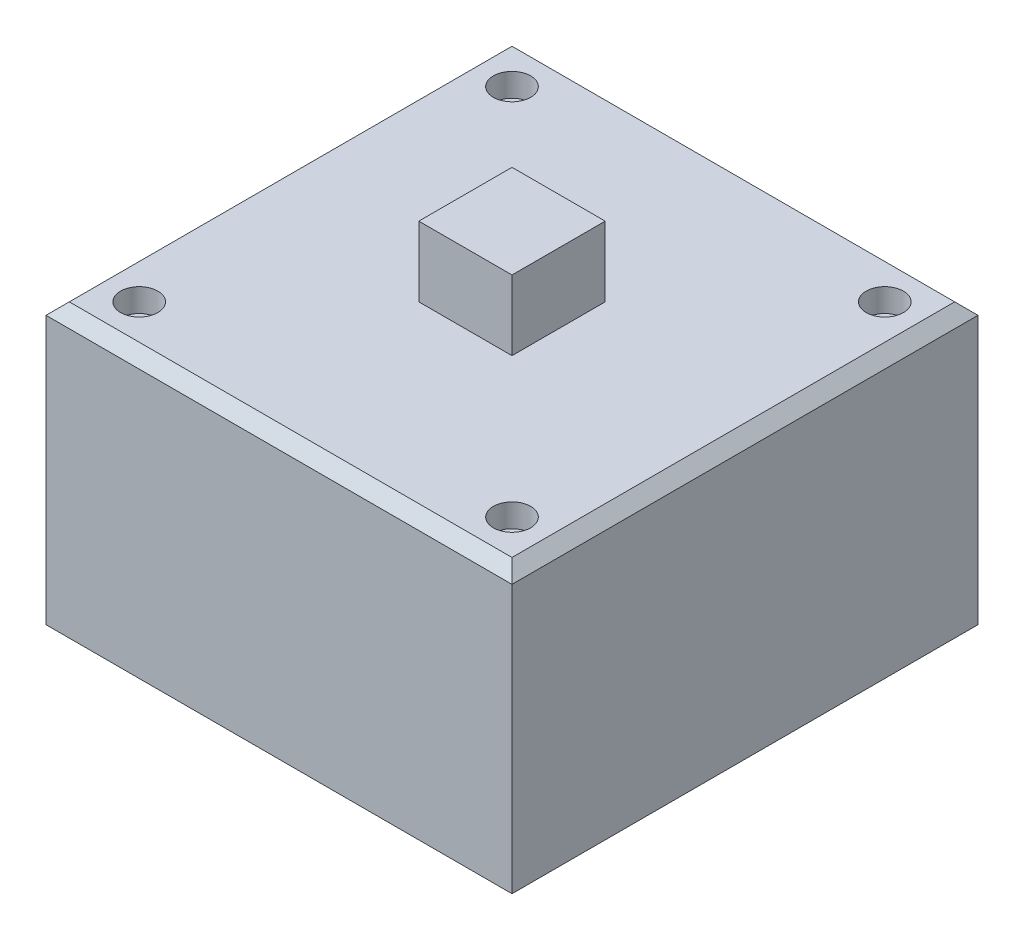
ISO-10303-21;
HEADER;
FILE_DESCRIPTION(('STEP AP214'),'2;1');
FILE_NAME('part.step','',(''),(''),'','','');
FILE_SCHEMA(('AUTOMOTIVE_DESIGN { 1 0 10303 214 1 1 1 1 }'));
ENDSEC;
DATA;
#1=APPLICATION_CONTEXT('core data for automotive mechanical design processes');
#2=APPLICATION_PROTOCOL_DEFINITION('international standard','automotive_design',2000,#1);
#3=PRODUCT_CONTEXT('',#1,'mechanical');
#4=PRODUCT('Part','Part','',(#3));
#5=PRODUCT_RELATED_PRODUCT_CATEGORY('part','',(#4));
#6=PRODUCT_DEFINITION_FORMATION('','',#4);
#7=PRODUCT_DEFINITION_CONTEXT('part definition',#1,'design');
#8=PRODUCT_DEFINITION('design','',#6,#7);
#9=PRODUCT_DEFINITION_SHAPE('','',#8);
#10=(LENGTH_UNIT() NAMED_UNIT(*) SI_UNIT(.MILLI.,.METRE.));
#11=(NAMED_UNIT(*) PLANE_ANGLE_UNIT() SI_UNIT($,.RADIAN.));
#12=(NAMED_UNIT(*) SI_UNIT($,.STERADIAN.) SOLID_ANGLE_UNIT());
#13=UNCERTAINTY_MEASURE_WITH_UNIT(LENGTH_MEASURE(1.E-05),#10,'distance_accuracy_value','');
#14=(GEOMETRIC_REPRESENTATION_CONTEXT(3) GLOBAL_UNCERTAINTY_ASSIGNED_CONTEXT((#13)) GLOBAL_UNIT_ASSIGNED_CONTEXT((#10,
#11,#12)) REPRESENTATION_CONTEXT('',''));
#15=CARTESIAN_POINT('',(0.,0.,0.));
#16=DIRECTION('',(0.,0.,1.));
#17=DIRECTION('',(1.,0.,0.));
#18=AXIS2_PLACEMENT_3D('',#15,#16,#17);
#19=CARTESIAN_POINT('',(-25.4,38.1,25.4));
#20=DIRECTION('',(1.,0.,0.));
#21=DIRECTION('',(0.,0.,-1.));
#22=AXIS2_PLACEMENT_3D('',#19,#20,#21);
#23=PLANE('',#22);
#24=DIRECTION('',(0.,-1.,0.));
#25=VECTOR('',#24,1.);
#26=CARTESIAN_POINT('',(-25.4,38.1,25.4));
#27=LINE('',#26,#25);
#28=CARTESIAN_POINT('',(-25.4,29.21,25.4));
#29=VERTEX_POINT('',#28);
#30=CARTESIAN_POINT('',(-25.4,0.,25.4));
#31=VERTEX_POINT('',#30);
#32=EDGE_CURVE('E233',#29,#31,#27,.T.);
#33=ORIENTED_EDGE('',*,*,#32,.F.);
#34=DIRECTION('',(0.,0.,-1.));
#35=VECTOR('',#34,1.);
#36=CARTESIAN_POINT('',(-25.4,29.21,-25.4));
#37=LINE('',#36,#35);
#38=CARTESIAN_POINT('',(-25.4,29.21,-25.4));
#39=VERTEX_POINT('',#38);
#40=EDGE_CURVE('E253',#29,#39,#37,.T.);
#41=ORIENTED_EDGE('',*,*,#40,.T.);
#42=DIRECTION('',(0.,-1.,0.));
#43=VECTOR('',#42,1.);
#44=CARTESIAN_POINT('',(-25.4,38.1,-25.4));
#45=LINE('',#44,#43);
#46=CARTESIAN_POINT('',(-25.4,0.,-25.4));
#47=VERTEX_POINT('',#46);
#48=EDGE_CURVE('E224',#39,#47,#45,.T.);
#49=ORIENTED_EDGE('',*,*,#48,.T.);
#50=DIRECTION('',(0.,0.,1.));
#51=VECTOR('',#50,1.);
#52=CARTESIAN_POINT('',(-25.4,0.,25.4));
#53=LINE('',#52,#51);
#54=EDGE_CURVE('E203',#47,#31,#53,.T.);
#55=ORIENTED_EDGE('',*,*,#54,.T.);
#56=EDGE_LOOP('',(#33,#41,#49,#55));
#57=FACE_BOUND('',#56,.T.);
#58=ADVANCED_FACE('F71',(#57),#23,.F.);
#59=CARTESIAN_POINT('',(25.4,38.1,25.4));
#60=DIRECTION('',(0.,0.,-1.));
#61=DIRECTION('',(-1.,0.,0.));
#62=AXIS2_PLACEMENT_3D('',#59,#60,#61);
#63=PLANE('',#62);
#64=DIRECTION('',(0.,-1.,0.));
#65=VECTOR('',#64,1.);
#66=CARTESIAN_POINT('',(25.4,38.1,25.4));
#67=LINE('',#66,#65);
#68=CARTESIAN_POINT('',(25.4,29.21,25.4));
#69=VERTEX_POINT('',#68);
#70=CARTESIAN_POINT('',(25.4,0.,25.4));
#71=VERTEX_POINT('',#70);
#72=EDGE_CURVE('E230',#69,#71,#67,.T.);
#73=ORIENTED_EDGE('',*,*,#72,.F.);
#74=DIRECTION('',(-1.,0.,0.));
#75=VECTOR('',#74,1.);
#76=CARTESIAN_POINT('',(-25.4,29.21,25.4));
#77=LINE('',#76,#75);
#78=EDGE_CURVE('E82',#69,#29,#77,.T.);
#79=ORIENTED_EDGE('',*,*,#78,.T.);
#80=ORIENTED_EDGE('',*,*,#32,.T.);
#81=DIRECTION('',(1.,0.,0.));
#82=VECTOR('',#81,1.);
#83=CARTESIAN_POINT('',(25.4,0.,25.4));
#84=LINE('',#83,#82);
#85=EDGE_CURVE('E212',#31,#71,#84,.T.);
#86=ORIENTED_EDGE('',*,*,#85,.T.);
#87=EDGE_LOOP('',(#73,#79,#80,#86));
#88=FACE_BOUND('',#87,.T.);
#89=ADVANCED_FACE('F359',(#88),#63,.F.);
#90=CARTESIAN_POINT('',(25.4,38.1,25.4));
#91=DIRECTION('',(-1.,0.,0.));
#92=DIRECTION('',(0.,0.,1.));
#93=AXIS2_PLACEMENT_3D('',#90,#91,#92);
#94=PLANE('',#93);
#95=DIRECTION('',(0.,-1.,0.));
#96=VECTOR('',#95,1.);
#97=CARTESIAN_POINT('',(25.4,38.1,-25.4));
#98=LINE('',#97,#96);
#99=CARTESIAN_POINT('',(25.4,29.21,-25.4));
#100=VERTEX_POINT('',#99);
#101=CARTESIAN_POINT('',(25.4,0.,-25.4));
#102=VERTEX_POINT('',#101);
#103=EDGE_CURVE('E227',#100,#102,#98,.T.);
#104=ORIENTED_EDGE('',*,*,#103,.F.);
#105=DIRECTION('',(0.,0.,1.));
#106=VECTOR('',#105,1.);
#107=CARTESIAN_POINT('',(25.4,29.21,25.4));
#108=LINE('',#107,#106);
#109=EDGE_CURVE('E12',#100,#69,#108,.T.);
#110=ORIENTED_EDGE('',*,*,#109,.T.);
#111=ORIENTED_EDGE('',*,*,#72,.T.);
#112=DIRECTION('',(0.,0.,-1.));
#113=VECTOR('',#112,1.);
#114=CARTESIAN_POINT('',(25.4,0.,25.4));
#115=LINE('',#114,#113);
#116=EDGE_CURVE('E216',#71,#102,#115,.T.);
#117=ORIENTED_EDGE('',*,*,#116,.T.);
#118=EDGE_LOOP('',(#104,#110,#111,#117));
#119=FACE_BOUND('',#118,.T.);
#120=ADVANCED_FACE('F366',(#119),#94,.F.);
#121=CARTESIAN_POINT('',(25.4,38.1,-25.4));
#122=DIRECTION('',(0.,0.,1.));
#123=DIRECTION('',(1.,0.,0.));
#124=AXIS2_PLACEMENT_3D('',#121,#122,#123);
#125=PLANE('',#124);
#126=ORIENTED_EDGE('',*,*,#48,.F.);
#127=DIRECTION('',(1.,0.,0.));
#128=VECTOR('',#127,1.);
#129=CARTESIAN_POINT('',(25.4,29.21,-25.4));
#130=LINE('',#129,#128);
#131=EDGE_CURVE('E249',#39,#100,#130,.T.);
#132=ORIENTED_EDGE('',*,*,#131,.T.);
#133=ORIENTED_EDGE('',*,*,#103,.T.);
#134=DIRECTION('',(-1.,0.,0.));
#135=VECTOR('',#134,1.);
#136=CARTESIAN_POINT('',(25.4,0.,-25.4));
#137=LINE('',#136,#135);
#138=EDGE_CURVE('E220',#102,#47,#137,.T.);
#139=ORIENTED_EDGE('',*,*,#138,.T.);
#140=EDGE_LOOP('',(#126,#132,#133,#139));
#141=FACE_BOUND('',#140,.T.);
#142=ADVANCED_FACE('F353',(#141),#125,.F.);
#143=CARTESIAN_POINT('',(0.,0.,0.));
#144=DIRECTION('',(0.,1.,0.));
#145=DIRECTION('',(0.,0.,1.));
#146=AXIS2_PLACEMENT_3D('',#143,#144,#145);
#147=PLANE('',#146);
#148=ORIENTED_EDGE('',*,*,#54,.F.);
#149=ORIENTED_EDGE('',*,*,#138,.F.);
#150=ORIENTED_EDGE('',*,*,#116,.F.);
#151=ORIENTED_EDGE('',*,*,#85,.F.);
#152=EDGE_LOOP('',(#148,#149,#150,#151));
#153=FACE_BOUND('',#152,.T.);
#154=ADVANCED_FACE('F342',(#153),#147,.F.);
#155=CARTESIAN_POINT('',(0.,30.48,0.));
#156=DIRECTION('',(0.,1.,0.));
#157=DIRECTION('',(0.,0.,1.));
#158=AXIS2_PLACEMENT_3D('',#155,#156,#157);
#159=PLANE('',#158);
#160=DIRECTION('',(0.,0.,-1.));
#161=VECTOR('',#160,1.);
#162=CARTESIAN_POINT('',(24.13,30.48,-25.4));
#163=LINE('',#162,#161);
#164=CARTESIAN_POINT('',(24.13,30.48,24.13));
#165=VERTEX_POINT('',#164);
#166=CARTESIAN_POINT('',(24.13,30.48,-24.13));
#167=VERTEX_POINT('',#166);
#168=EDGE_CURVE('E236',#165,#167,#163,.T.);
#169=ORIENTED_EDGE('',*,*,#168,.T.);
#170=DIRECTION('',(-1.,0.,0.));
#171=VECTOR('',#170,1.);
#172=CARTESIAN_POINT('',(-25.4,30.48,-24.13));
#173=LINE('',#172,#171);
#174=CARTESIAN_POINT('',(-24.13,30.48,-24.13));
#175=VERTEX_POINT('',#174);
#176=EDGE_CURVE('E245',#167,#175,#173,.T.);
#177=ORIENTED_EDGE('',*,*,#176,.T.);
#178=DIRECTION('',(0.,0.,1.));
#179=VECTOR('',#178,1.);
#180=CARTESIAN_POINT('',(-24.13,30.48,25.4));
#181=LINE('',#180,#179);
#182=CARTESIAN_POINT('',(-24.13,30.48,24.13));
#183=VERTEX_POINT('',#182);
#184=EDGE_CURVE('E242',#175,#183,#181,.T.);
#185=ORIENTED_EDGE('',*,*,#184,.T.);
#186=DIRECTION('',(1.,0.,0.));
#187=VECTOR('',#186,1.);
#188=CARTESIAN_POINT('',(25.4,30.48,24.13));
#189=LINE('',#188,#187);
#190=EDGE_CURVE('E239',#183,#165,#189,.T.);
#191=ORIENTED_EDGE('',*,*,#190,.T.);
#192=EDGE_LOOP('',(#169,#177,#185,#191));
#193=FACE_BOUND('',#192,.T.);
#194=CARTESIAN_POINT('',(20.3199999999998,30.48,20.3200000000002));
#195=DIRECTION('',(0.,1.,0.));
#196=DIRECTION('',(0.,0.,1.));
#197=AXIS2_PLACEMENT_3D('',#194,#195,#196);
#198=CIRCLE('',#197,2.032);
#199=CARTESIAN_POINT('',(20.3199999999998,30.48,22.3520000000002));
#200=VERTEX_POINT('',#199);
#201=EDGE_CURVE('E325',#200,#200,#198,.T.);
#202=ORIENTED_EDGE('',*,*,#201,.F.);
#203=EDGE_LOOP('',(#202));
#204=FACE_BOUND('',#203,.T.);
#205=CARTESIAN_POINT('',(20.3200000000001,30.48,-20.3199999999999));
#206=DIRECTION('',(0.,1.,0.));
#207=DIRECTION('',(0.,0.,1.));
#208=AXIS2_PLACEMENT_3D('',#205,#206,#207);
#209=CIRCLE('',#208,2.032);
#210=CARTESIAN_POINT('',(20.3200000000001,30.48,-18.2879999999999));
#211=VERTEX_POINT('',#210);
#212=EDGE_CURVE('E317',#211,#211,#209,.T.);
#213=ORIENTED_EDGE('',*,*,#212,.F.);
#214=EDGE_LOOP('',(#213));
#215=FACE_BOUND('',#214,.T.);
#216=CARTESIAN_POINT('',(-20.3199999999999,30.48,-20.3200000000001));
#217=DIRECTION('',(0.,1.,0.));
#218=DIRECTION('',(0.,0.,1.));
#219=AXIS2_PLACEMENT_3D('',#216,#217,#218);
#220=CIRCLE('',#219,2.032);
#221=CARTESIAN_POINT('',(-20.3199999999999,30.48,-18.2880000000001));
#222=VERTEX_POINT('',#221);
#223=EDGE_CURVE('E309',#222,#222,#220,.T.);
#224=ORIENTED_EDGE('',*,*,#223,.F.);
#225=EDGE_LOOP('',(#224));
#226=FACE_BOUND('',#225,.T.);
#227=CARTESIAN_POINT('',(-20.32,30.48,20.32));
#228=DIRECTION('',(0.,1.,0.));
#229=DIRECTION('',(0.,0.,1.));
#230=AXIS2_PLACEMENT_3D('',#227,#228,#229);
#231=CIRCLE('',#230,2.032);
#232=CARTESIAN_POINT('',(-20.32,30.48,22.352));
#233=VERTEX_POINT('',#232);
#234=EDGE_CURVE('E186',#233,#233,#231,.T.);
#235=ORIENTED_EDGE('',*,*,#234,.F.);
#236=EDGE_LOOP('',(#235));
#237=FACE_BOUND('',#236,.T.);
#238=DIRECTION('',(0.,0.,-1.));
#239=VECTOR('',#238,1.);
#240=CARTESIAN_POINT('',(5.08,30.48,5.08));
#241=LINE('',#240,#239);
#242=CARTESIAN_POINT('',(5.08,30.48,5.08));
#243=VERTEX_POINT('',#242);
#244=CARTESIAN_POINT('',(5.08,30.48,-5.08));
#245=VERTEX_POINT('',#244);
#246=EDGE_CURVE('E174',#243,#245,#241,.T.);
#247=ORIENTED_EDGE('',*,*,#246,.F.);
#248=DIRECTION('',(-1.,0.,0.));
#249=VECTOR('',#248,1.);
#250=CARTESIAN_POINT('',(5.08,30.48,5.08));
#251=LINE('',#250,#249);
#252=CARTESIAN_POINT('',(-5.08,30.48,5.08));
#253=VERTEX_POINT('',#252);
#254=EDGE_CURVE('E159',#243,#253,#251,.T.);
#255=ORIENTED_EDGE('',*,*,#254,.T.);
#256=DIRECTION('',(0.,0.,-1.));
#257=VECTOR('',#256,1.);
#258=CARTESIAN_POINT('',(-5.08,30.48,5.08));
#259=LINE('',#258,#257);
#260=CARTESIAN_POINT('',(-5.08,30.48,-5.08));
#261=VERTEX_POINT('',#260);
#262=EDGE_CURVE('E151',#253,#261,#259,.T.);
#263=ORIENTED_EDGE('',*,*,#262,.T.);
#264=DIRECTION('',(-1.,0.,0.));
#265=VECTOR('',#264,1.);
#266=CARTESIAN_POINT('',(5.08,30.48,-5.08));
#267=LINE('',#266,#265);
#268=EDGE_CURVE('E156',#245,#261,#267,.T.);
#269=ORIENTED_EDGE('',*,*,#268,.F.);
#270=EDGE_LOOP('',(#247,#255,#263,#269));
#271=FACE_BOUND('',#270,.T.);
#272=ADVANCED_FACE('F154',(#193,#204,#215,#226,#237,#271),#159,.T.);
#273=CARTESIAN_POINT('',(5.08,30.48,-5.08));
#274=DIRECTION('',(0.,0.,-1.));
#275=DIRECTION('',(-1.,0.,0.));
#276=AXIS2_PLACEMENT_3D('',#273,#274,#275);
#277=PLANE('',#276);
#278=DIRECTION('',(-1.,0.,0.));
#279=VECTOR('',#278,1.);
#280=CARTESIAN_POINT('',(5.08,38.1,-5.08));
#281=LINE('',#280,#279);
#282=CARTESIAN_POINT('',(5.08,38.1,-5.08));
#283=VERTEX_POINT('',#282);
#284=CARTESIAN_POINT('',(-5.08,38.1,-5.08));
#285=VERTEX_POINT('',#284);
#286=EDGE_CURVE('E193',#283,#285,#281,.T.);
#287=ORIENTED_EDGE('',*,*,#286,.F.);
#288=DIRECTION('',(0.,1.,0.));
#289=VECTOR('',#288,1.);
#290=CARTESIAN_POINT('',(5.08,30.48,-5.08));
#291=LINE('',#290,#289);
#292=EDGE_CURVE('E177',#245,#283,#291,.T.);
#293=ORIENTED_EDGE('',*,*,#292,.F.);
#294=ORIENTED_EDGE('',*,*,#268,.T.);
#295=DIRECTION('',(0.,1.,0.));
#296=VECTOR('',#295,1.);
#297=CARTESIAN_POINT('',(-5.08,30.48,-5.08));
#298=LINE('',#297,#296);
#299=EDGE_CURVE('E165',#261,#285,#298,.T.);
#300=ORIENTED_EDGE('',*,*,#299,.T.);
#301=EDGE_LOOP('',(#287,#293,#294,#300));
#302=FACE_BOUND('',#301,.T.);
#303=ADVANCED_FACE('F176',(#302),#277,.T.);
#304=CARTESIAN_POINT('',(5.08,30.48,5.08));
#305=DIRECTION('',(1.,0.,0.));
#306=DIRECTION('',(0.,0.,-1.));
#307=AXIS2_PLACEMENT_3D('',#304,#305,#306);
#308=PLANE('',#307);
#309=DIRECTION('',(0.,0.,-1.));
#310=VECTOR('',#309,1.);
#311=CARTESIAN_POINT('',(5.08,38.1,5.08));
#312=LINE('',#311,#310);
#313=CARTESIAN_POINT('',(5.08,38.1,5.08));
#314=VERTEX_POINT('',#313);
#315=EDGE_CURVE('E179',#314,#283,#312,.T.);
#316=ORIENTED_EDGE('',*,*,#315,.F.);
#317=DIRECTION('',(0.,1.,0.));
#318=VECTOR('',#317,1.);
#319=CARTESIAN_POINT('',(5.08,30.48,5.08));
#320=LINE('',#319,#318);
#321=EDGE_CURVE('E204',#243,#314,#320,.T.);
#322=ORIENTED_EDGE('',*,*,#321,.F.);
#323=ORIENTED_EDGE('',*,*,#246,.T.);
#324=ORIENTED_EDGE('',*,*,#292,.T.);
#325=EDGE_LOOP('',(#316,#322,#323,#324));
#326=FACE_BOUND('',#325,.T.);
#327=ADVANCED_FACE('F350',(#326),#308,.T.);
#328=CARTESIAN_POINT('',(5.08,30.48,5.08));
#329=DIRECTION('',(0.,0.,-1.));
#330=DIRECTION('',(-1.,0.,0.));
#331=AXIS2_PLACEMENT_3D('',#328,#329,#330);
#332=PLANE('',#331);
#333=DIRECTION('',(-1.,0.,0.));
#334=VECTOR('',#333,1.);
#335=CARTESIAN_POINT('',(5.08,38.1,5.08));
#336=LINE('',#335,#334);
#337=CARTESIAN_POINT('',(-5.08,38.1,5.08));
#338=VERTEX_POINT('',#337);
#339=EDGE_CURVE('E183',#314,#338,#336,.T.);
#340=ORIENTED_EDGE('',*,*,#339,.T.);
#341=DIRECTION('',(0.,1.,0.));
#342=VECTOR('',#341,1.);
#343=CARTESIAN_POINT('',(-5.08,30.48,5.08));
#344=LINE('',#343,#342);
#345=EDGE_CURVE('E173',#253,#338,#344,.T.);
#346=ORIENTED_EDGE('',*,*,#345,.F.);
#347=ORIENTED_EDGE('',*,*,#254,.F.);
#348=ORIENTED_EDGE('',*,*,#321,.T.);
#349=EDGE_LOOP('',(#340,#346,#347,#348));
#350=FACE_BOUND('',#349,.T.);
#351=ADVANCED_FACE('F421',(#350),#332,.F.);
#352=CARTESIAN_POINT('',(-5.08,30.48,5.08));
#353=DIRECTION('',(1.,0.,0.));
#354=DIRECTION('',(0.,0.,-1.));
#355=AXIS2_PLACEMENT_3D('',#352,#353,#354);
#356=PLANE('',#355);
#357=DIRECTION('',(0.,0.,-1.));
#358=VECTOR('',#357,1.);
#359=CARTESIAN_POINT('',(-5.08,38.1,5.08));
#360=LINE('',#359,#358);
#361=EDGE_CURVE('E168',#338,#285,#360,.T.);
#362=ORIENTED_EDGE('',*,*,#361,.T.);
#363=ORIENTED_EDGE('',*,*,#299,.F.);
#364=ORIENTED_EDGE('',*,*,#262,.F.);
#365=ORIENTED_EDGE('',*,*,#345,.T.);
#366=EDGE_LOOP('',(#362,#363,#364,#365));
#367=FACE_BOUND('',#366,.T.);
#368=ADVANCED_FACE('F166',(#367),#356,.F.);
#369=CARTESIAN_POINT('',(0.,38.1,0.));
#370=DIRECTION('',(0.,1.,0.));
#371=DIRECTION('',(0.,0.,1.));
#372=AXIS2_PLACEMENT_3D('',#369,#370,#371);
#373=PLANE('',#372);
#374=ORIENTED_EDGE('',*,*,#315,.T.);
#375=ORIENTED_EDGE('',*,*,#286,.T.);
#376=ORIENTED_EDGE('',*,*,#361,.F.);
#377=ORIENTED_EDGE('',*,*,#339,.F.);
#378=EDGE_LOOP('',(#374,#375,#376,#377));
#379=FACE_BOUND('',#378,.T.);
#380=ADVANCED_FACE('F411',(#379),#373,.T.);
#381=CARTESIAN_POINT('',(-20.32,27.94,20.32));
#382=DIRECTION('',(0.,1.,0.));
#383=DIRECTION('',(0.,0.,1.));
#384=AXIS2_PLACEMENT_3D('',#381,#382,#383);
#385=CYLINDRICAL_SURFACE('',#384,2.032);
#386=CARTESIAN_POINT('',(-20.32,27.94,20.32));
#387=DIRECTION('',(0.,1.,0.));
#388=DIRECTION('',(0.,0.,1.));
#389=AXIS2_PLACEMENT_3D('',#386,#387,#388);
#390=CIRCLE('',#389,2.032);
#391=CARTESIAN_POINT('',(-20.32,27.94,22.352));
#392=VERTEX_POINT('',#391);
#393=EDGE_CURVE('E196',#392,#392,#390,.T.);
#394=ORIENTED_EDGE('',*,*,#393,.F.);
#395=EDGE_LOOP('',(#394));
#396=FACE_BOUND('',#395,.T.);
#397=ORIENTED_EDGE('',*,*,#234,.T.);
#398=EDGE_LOOP('',(#397));
#399=FACE_BOUND('',#398,.T.);
#400=ADVANCED_FACE('F339',(#396,#399),#385,.F.);
#401=CARTESIAN_POINT('',(-20.32,27.94,20.32));
#402=DIRECTION('',(0.,1.,0.));
#403=DIRECTION('',(0.,0.,1.));
#404=AXIS2_PLACEMENT_3D('',#401,#402,#403);
#405=PLANE('',#404);
#406=CARTESIAN_POINT('',(-20.32,27.94,20.32));
#407=DIRECTION('',(0.,1.,0.));
#408=DIRECTION('',(0.,0.,1.));
#409=AXIS2_PLACEMENT_3D('',#406,#407,#408);
#410=CIRCLE('',#409,1.524);
#411=CARTESIAN_POINT('',(-20.32,27.94,21.844));
#412=VERTEX_POINT('',#411);
#413=EDGE_CURVE('E304',#412,#412,#410,.T.);
#414=ORIENTED_EDGE('',*,*,#413,.F.);
#415=EDGE_LOOP('',(#414));
#416=FACE_BOUND('',#415,.T.);
#417=ORIENTED_EDGE('',*,*,#393,.T.);
#418=EDGE_LOOP('',(#417));
#419=FACE_BOUND('',#418,.T.);
#420=ADVANCED_FACE('F418',(#416,#419),#405,.T.);
#421=CARTESIAN_POINT('',(-20.3199999999999,27.94,-20.3200000000001));
#422=DIRECTION('',(0.,1.,0.));
#423=DIRECTION('',(0.,0.,1.));
#424=AXIS2_PLACEMENT_3D('',#421,#422,#423);
#425=CYLINDRICAL_SURFACE('',#424,2.032);
#426=CARTESIAN_POINT('',(-20.3199999999999,27.94,-20.3200000000001));
#427=DIRECTION('',(0.,1.,0.));
#428=DIRECTION('',(0.,0.,1.));
#429=AXIS2_PLACEMENT_3D('',#426,#427,#428);
#430=CIRCLE('',#429,2.032);
#431=CARTESIAN_POINT('',(-20.3199999999999,27.94,-18.2880000000001));
#432=VERTEX_POINT('',#431);
#433=EDGE_CURVE('E313',#432,#432,#430,.T.);
#434=ORIENTED_EDGE('',*,*,#433,.F.);
#435=EDGE_LOOP('',(#434));
#436=FACE_BOUND('',#435,.T.);
#437=ORIENTED_EDGE('',*,*,#223,.T.);
#438=EDGE_LOOP('',(#437));
#439=FACE_BOUND('',#438,.T.);
#440=ADVANCED_FACE('F436',(#436,#439),#425,.F.);
#441=CARTESIAN_POINT('',(-20.3199999999999,27.94,-20.3200000000001));
#442=DIRECTION('',(0.,1.,0.));
#443=DIRECTION('',(0.,0.,1.));
#444=AXIS2_PLACEMENT_3D('',#441,#442,#443);
#445=PLANE('',#444);
#446=CARTESIAN_POINT('',(-20.3199999999999,27.94,-20.3200000000001));
#447=DIRECTION('',(0.,1.,0.));
#448=DIRECTION('',(0.,0.,1.));
#449=AXIS2_PLACEMENT_3D('',#446,#447,#448);
#450=CIRCLE('',#449,1.524);
#451=CARTESIAN_POINT('',(-20.3199999999999,27.94,-18.7960000000001));
#452=VERTEX_POINT('',#451);
#453=EDGE_CURVE('E300',#452,#452,#450,.T.);
#454=ORIENTED_EDGE('',*,*,#453,.F.);
#455=EDGE_LOOP('',(#454));
#456=FACE_BOUND('',#455,.T.);
#457=ORIENTED_EDGE('',*,*,#433,.T.);
#458=EDGE_LOOP('',(#457));
#459=FACE_BOUND('',#458,.T.);
#460=ADVANCED_FACE('F454',(#456,#459),#445,.T.);
#461=CARTESIAN_POINT('',(20.3200000000001,27.94,-20.3199999999999));
#462=DIRECTION('',(0.,1.,0.));
#463=DIRECTION('',(0.,0.,1.));
#464=AXIS2_PLACEMENT_3D('',#461,#462,#463);
#465=CYLINDRICAL_SURFACE('',#464,2.032);
#466=CARTESIAN_POINT('',(20.3200000000001,27.94,-20.3199999999999));
#467=DIRECTION('',(0.,1.,0.));
#468=DIRECTION('',(0.,0.,1.));
#469=AXIS2_PLACEMENT_3D('',#466,#467,#468);
#470=CIRCLE('',#469,2.032);
#471=CARTESIAN_POINT('',(20.3200000000001,27.94,-18.2879999999999));
#472=VERTEX_POINT('',#471);
#473=EDGE_CURVE('E321',#472,#472,#470,.T.);
#474=ORIENTED_EDGE('',*,*,#473,.F.);
#475=EDGE_LOOP('',(#474));
#476=FACE_BOUND('',#475,.T.);
#477=ORIENTED_EDGE('',*,*,#212,.T.);
#478=EDGE_LOOP('',(#477));
#479=FACE_BOUND('',#478,.T.);
#480=ADVANCED_FACE('F450',(#476,#479),#465,.F.);
#481=CARTESIAN_POINT('',(20.3200000000001,27.94,-20.3199999999999));
#482=DIRECTION('',(0.,1.,0.));
#483=DIRECTION('',(0.,0.,1.));
#484=AXIS2_PLACEMENT_3D('',#481,#482,#483);
#485=PLANE('',#484);
#486=CARTESIAN_POINT('',(20.3200000000001,27.94,-20.3199999999999));
#487=DIRECTION('',(0.,1.,0.));
#488=DIRECTION('',(0.,0.,1.));
#489=AXIS2_PLACEMENT_3D('',#486,#487,#488);
#490=CIRCLE('',#489,1.524);
#491=CARTESIAN_POINT('',(20.3200000000001,27.94,-18.7959999999999));
#492=VERTEX_POINT('',#491);
#493=EDGE_CURVE('E296',#492,#492,#490,.T.);
#494=ORIENTED_EDGE('',*,*,#493,.F.);
#495=EDGE_LOOP('',(#494));
#496=FACE_BOUND('',#495,.T.);
#497=ORIENTED_EDGE('',*,*,#473,.T.);
#498=EDGE_LOOP('',(#497));
#499=FACE_BOUND('',#498,.T.);
#500=ADVANCED_FACE('F446',(#496,#499),#485,.T.);
#501=CARTESIAN_POINT('',(20.3199999999998,27.94,20.3200000000002));
#502=DIRECTION('',(0.,1.,0.));
#503=DIRECTION('',(0.,0.,1.));
#504=AXIS2_PLACEMENT_3D('',#501,#502,#503);
#505=CYLINDRICAL_SURFACE('',#504,2.032);
#506=CARTESIAN_POINT('',(20.3199999999998,27.94,20.3200000000002));
#507=DIRECTION('',(0.,1.,0.));
#508=DIRECTION('',(0.,0.,1.));
#509=AXIS2_PLACEMENT_3D('',#506,#507,#508);
#510=CIRCLE('',#509,2.032);
#511=CARTESIAN_POINT('',(20.3199999999998,27.94,22.3520000000002));
#512=VERTEX_POINT('',#511);
#513=EDGE_CURVE('E308',#512,#512,#510,.T.);
#514=ORIENTED_EDGE('',*,*,#513,.F.);
#515=EDGE_LOOP('',(#514));
#516=FACE_BOUND('',#515,.T.);
#517=ORIENTED_EDGE('',*,*,#201,.T.);
#518=EDGE_LOOP('',(#517));
#519=FACE_BOUND('',#518,.T.);
#520=ADVANCED_FACE('F442',(#516,#519),#505,.F.);
#521=CARTESIAN_POINT('',(20.3199999999998,27.94,20.3200000000002));
#522=DIRECTION('',(0.,1.,0.));
#523=DIRECTION('',(0.,0.,1.));
#524=AXIS2_PLACEMENT_3D('',#521,#522,#523);
#525=PLANE('',#524);
#526=CARTESIAN_POINT('',(20.3199999999998,27.94,20.3200000000002));
#527=DIRECTION('',(0.,1.,0.));
#528=DIRECTION('',(0.,0.,1.));
#529=AXIS2_PLACEMENT_3D('',#526,#527,#528);
#530=CIRCLE('',#529,1.524);
#531=CARTESIAN_POINT('',(20.3199999999998,27.94,21.8440000000002));
#532=VERTEX_POINT('',#531);
#533=EDGE_CURVE('E292',#532,#532,#530,.T.);
#534=ORIENTED_EDGE('',*,*,#533,.F.);
#535=EDGE_LOOP('',(#534));
#536=FACE_BOUND('',#535,.T.);
#537=ORIENTED_EDGE('',*,*,#513,.T.);
#538=EDGE_LOOP('',(#537));
#539=FACE_BOUND('',#538,.T.);
#540=ADVANCED_FACE('F438',(#536,#539),#525,.T.);
#541=CARTESIAN_POINT('',(20.3199999999998,10.16,20.3200000000002));
#542=DIRECTION('',(0.,1.,0.));
#543=DIRECTION('',(0.,0.,1.));
#544=AXIS2_PLACEMENT_3D('',#541,#542,#543);
#545=CYLINDRICAL_SURFACE('',#544,1.524);
#546=ORIENTED_EDGE('',*,*,#533,.T.);
#547=EDGE_LOOP('',(#546));
#548=FACE_BOUND('',#547,.T.);
#549=CARTESIAN_POINT('',(20.3199999999998,10.16,20.3200000000002));
#550=DIRECTION('',(0.,1.,0.));
#551=DIRECTION('',(0.,0.,1.));
#552=AXIS2_PLACEMENT_3D('',#549,#550,#551);
#553=CIRCLE('',#552,1.524);
#554=CARTESIAN_POINT('',(20.3199999999998,10.16,21.8440000000002));
#555=VERTEX_POINT('',#554);
#556=EDGE_CURVE('E272',#555,#555,#553,.T.);
#557=ORIENTED_EDGE('',*,*,#556,.F.);
#558=EDGE_LOOP('',(#557));
#559=FACE_BOUND('',#558,.T.);
#560=ADVANCED_FACE('F441',(#548,#559),#545,.F.);
#561=CARTESIAN_POINT('',(20.3199999999998,10.16,20.3200000000002));
#562=DIRECTION('',(0.,1.,0.));
#563=DIRECTION('',(0.,0.,1.));
#564=AXIS2_PLACEMENT_3D('',#561,#562,#563);
#565=PLANE('',#564);
#566=ORIENTED_EDGE('',*,*,#556,.T.);
#567=EDGE_LOOP('',(#566));
#568=FACE_BOUND('',#567,.T.);
#569=ADVANCED_FACE('F466',(#568),#565,.T.);
#570=CARTESIAN_POINT('',(20.3200000000001,10.16,-20.3199999999999));
#571=DIRECTION('',(0.,1.,0.));
#572=DIRECTION('',(0.,0.,1.));
#573=AXIS2_PLACEMENT_3D('',#570,#571,#572);
#574=CYLINDRICAL_SURFACE('',#573,1.524);
#575=ORIENTED_EDGE('',*,*,#493,.T.);
#576=EDGE_LOOP('',(#575));
#577=FACE_BOUND('',#576,.T.);
#578=CARTESIAN_POINT('',(20.3200000000001,10.16,-20.3199999999999));
#579=DIRECTION('',(0.,1.,0.));
#580=DIRECTION('',(0.,0.,1.));
#581=AXIS2_PLACEMENT_3D('',#578,#579,#580);
#582=CIRCLE('',#581,1.524);
#583=CARTESIAN_POINT('',(20.3200000000001,10.16,-18.7959999999999));
#584=VERTEX_POINT('',#583);
#585=EDGE_CURVE('E278',#584,#584,#582,.T.);
#586=ORIENTED_EDGE('',*,*,#585,.F.);
#587=EDGE_LOOP('',(#586));
#588=FACE_BOUND('',#587,.T.);
#589=ADVANCED_FACE('F469',(#577,#588),#574,.F.);
#590=CARTESIAN_POINT('',(20.3200000000001,10.16,-20.3199999999999));
#591=DIRECTION('',(0.,1.,0.));
#592=DIRECTION('',(0.,0.,1.));
#593=AXIS2_PLACEMENT_3D('',#590,#591,#592);
#594=PLANE('',#593);
#595=ORIENTED_EDGE('',*,*,#585,.T.);
#596=EDGE_LOOP('',(#595));
#597=FACE_BOUND('',#596,.T.);
#598=ADVANCED_FACE('F473',(#597),#594,.T.);
#599=CARTESIAN_POINT('',(-20.3199999999999,10.16,-20.3200000000001));
#600=DIRECTION('',(0.,1.,0.));
#601=DIRECTION('',(0.,0.,1.));
#602=AXIS2_PLACEMENT_3D('',#599,#600,#601);
#603=CYLINDRICAL_SURFACE('',#602,1.524);
#604=ORIENTED_EDGE('',*,*,#453,.T.);
#605=EDGE_LOOP('',(#604));
#606=FACE_BOUND('',#605,.T.);
#607=CARTESIAN_POINT('',(-20.3199999999999,10.16,-20.3200000000001));
#608=DIRECTION('',(0.,1.,0.));
#609=DIRECTION('',(0.,0.,1.));
#610=AXIS2_PLACEMENT_3D('',#607,#608,#609);
#611=CIRCLE('',#610,1.524);
#612=CARTESIAN_POINT('',(-20.3199999999999,10.16,-18.7960000000001));
#613=VERTEX_POINT('',#612);
#614=EDGE_CURVE('E284',#613,#613,#611,.T.);
#615=ORIENTED_EDGE('',*,*,#614,.F.);
#616=EDGE_LOOP('',(#615));
#617=FACE_BOUND('',#616,.T.);
#618=ADVANCED_FACE('F476',(#606,#617),#603,.F.);
#619=CARTESIAN_POINT('',(-20.3199999999999,10.16,-20.3200000000001));
#620=DIRECTION('',(0.,1.,0.));
#621=DIRECTION('',(0.,0.,1.));
#622=AXIS2_PLACEMENT_3D('',#619,#620,#621);
#623=PLANE('',#622);
#624=ORIENTED_EDGE('',*,*,#614,.T.);
#625=EDGE_LOOP('',(#624));
#626=FACE_BOUND('',#625,.T.);
#627=ADVANCED_FACE('F463',(#626),#623,.T.);
#628=CARTESIAN_POINT('',(-20.32,10.16,20.32));
#629=DIRECTION('',(0.,1.,0.));
#630=DIRECTION('',(0.,0.,1.));
#631=AXIS2_PLACEMENT_3D('',#628,#629,#630);
#632=CYLINDRICAL_SURFACE('',#631,1.524);
#633=ORIENTED_EDGE('',*,*,#413,.T.);
#634=EDGE_LOOP('',(#633));
#635=FACE_BOUND('',#634,.T.);
#636=CARTESIAN_POINT('',(-20.32,10.16,20.32));
#637=DIRECTION('',(0.,1.,0.));
#638=DIRECTION('',(0.,0.,1.));
#639=AXIS2_PLACEMENT_3D('',#636,#637,#638);
#640=CIRCLE('',#639,1.524);
#641=CARTESIAN_POINT('',(-20.32,10.16,21.844));
#642=VERTEX_POINT('',#641);
#643=EDGE_CURVE('E288',#642,#642,#640,.T.);
#644=ORIENTED_EDGE('',*,*,#643,.F.);
#645=EDGE_LOOP('',(#644));
#646=FACE_BOUND('',#645,.T.);
#647=ADVANCED_FACE('F393',(#635,#646),#632,.F.);
#648=CARTESIAN_POINT('',(-20.32,10.16,20.32));
#649=DIRECTION('',(0.,1.,0.));
#650=DIRECTION('',(0.,0.,1.));
#651=AXIS2_PLACEMENT_3D('',#648,#649,#650);
#652=PLANE('',#651);
#653=ORIENTED_EDGE('',*,*,#643,.T.);
#654=EDGE_LOOP('',(#653));
#655=FACE_BOUND('',#654,.T.);
#656=ADVANCED_FACE('F389',(#655),#652,.T.);
#657=CARTESIAN_POINT('',(0.,30.48,24.13));
#658=DIRECTION('',(0.,0.707106781186547,0.707106781186547));
#659=DIRECTION('',(-1.,0.,0.));
#660=AXIS2_PLACEMENT_3D('',#657,#658,#659);
#661=PLANE('',#660);
#662=DIRECTION('',(-0.577350269189626,-0.577350269189626,0.577350269189626));
#663=VECTOR('',#662,1.);
#664=CARTESIAN_POINT('',(-16.0866666666666,38.5233333333333,16.0866666666667));
#665=LINE('',#664,#663);
#666=EDGE_CURVE('E263',#29,#183,#665,.F.);
#667=ORIENTED_EDGE('',*,*,#666,.F.);
#668=ORIENTED_EDGE('',*,*,#78,.F.);
#669=DIRECTION('',(0.577350269189626,-0.577350269189626,0.577350269189626));
#670=VECTOR('',#669,1.);
#671=CARTESIAN_POINT('',(16.0866666666667,38.5233333333333,16.0866666666667));
#672=LINE('',#671,#670);
#673=EDGE_CURVE('E76',#165,#69,#672,.T.);
#674=ORIENTED_EDGE('',*,*,#673,.F.);
#675=ORIENTED_EDGE('',*,*,#190,.F.);
#676=EDGE_LOOP('',(#667,#668,#674,#675));
#677=FACE_BOUND('',#676,.T.);
#678=ADVANCED_FACE('F74',(#677),#661,.T.);
#679=CARTESIAN_POINT('',(24.13,30.48,0.));
#680=DIRECTION('',(0.707106781186547,0.707106781186547,0.));
#681=DIRECTION('',(0.,0.,1.));
#682=AXIS2_PLACEMENT_3D('',#679,#680,#681);
#683=PLANE('',#682);
#684=ORIENTED_EDGE('',*,*,#673,.T.);
#685=ORIENTED_EDGE('',*,*,#109,.F.);
#686=DIRECTION('',(-0.577350269189626,0.577350269189626,0.577350269189626));
#687=VECTOR('',#686,1.);
#688=CARTESIAN_POINT('',(16.0866666666667,38.5233333333333,-16.0866666666667));
#689=LINE('',#688,#687);
#690=EDGE_CURVE('E261',#167,#100,#689,.F.);
#691=ORIENTED_EDGE('',*,*,#690,.F.);
#692=ORIENTED_EDGE('',*,*,#168,.F.);
#693=EDGE_LOOP('',(#684,#685,#691,#692));
#694=FACE_BOUND('',#693,.T.);
#695=ADVANCED_FACE('F383',(#694),#683,.T.);
#696=CARTESIAN_POINT('',(-24.13,30.48,0.));
#697=DIRECTION('',(-0.707106781186547,0.707106781186547,0.));
#698=DIRECTION('',(0.,0.,-1.));
#699=AXIS2_PLACEMENT_3D('',#696,#697,#698);
#700=PLANE('',#699);
#701=ORIENTED_EDGE('',*,*,#666,.T.);
#702=ORIENTED_EDGE('',*,*,#184,.F.);
#703=DIRECTION('',(-0.577350269189626,-0.577350269189626,-0.577350269189626));
#704=VECTOR('',#703,1.);
#705=CARTESIAN_POINT('',(-16.0866666666667,38.5233333333333,-16.0866666666667));
#706=LINE('',#705,#704);
#707=EDGE_CURVE('E258',#39,#175,#706,.F.);
#708=ORIENTED_EDGE('',*,*,#707,.F.);
#709=ORIENTED_EDGE('',*,*,#40,.F.);
#710=EDGE_LOOP('',(#701,#702,#708,#709));
#711=FACE_BOUND('',#710,.T.);
#712=ADVANCED_FACE('F377',(#711),#700,.T.);
#713=CARTESIAN_POINT('',(0.,30.48,-24.13));
#714=DIRECTION('',(0.,0.707106781186547,-0.707106781186547));
#715=DIRECTION('',(1.,0.,0.));
#716=AXIS2_PLACEMENT_3D('',#713,#714,#715);
#717=PLANE('',#716);
#718=ORIENTED_EDGE('',*,*,#690,.T.);
#719=ORIENTED_EDGE('',*,*,#131,.F.);
#720=ORIENTED_EDGE('',*,*,#707,.T.);
#721=ORIENTED_EDGE('',*,*,#176,.F.);
#722=EDGE_LOOP('',(#718,#719,#720,#721));
#723=FACE_BOUND('',#722,.T.);
#724=ADVANCED_FACE('F371',(#723),#717,.T.);
#725=CLOSED_SHELL('',(#58,#89,#120,#142,#154,#272,#303,#327,#351,#368,#380,#400,#420,#440,#460,
#480,#500,#520,#540,#560,#569,#589,#598,#618,#627,#647,#656,#678,#695,#712,#724));
#726=MANIFOLD_SOLID_BREP('B2',#725);
#727=ADVANCED_BREP_SHAPE_REPRESENTATION('',(#18,#726),#14);
#728=SHAPE_DEFINITION_REPRESENTATION(#9,#727);
ENDSEC;
END-ISO-10303-21;
